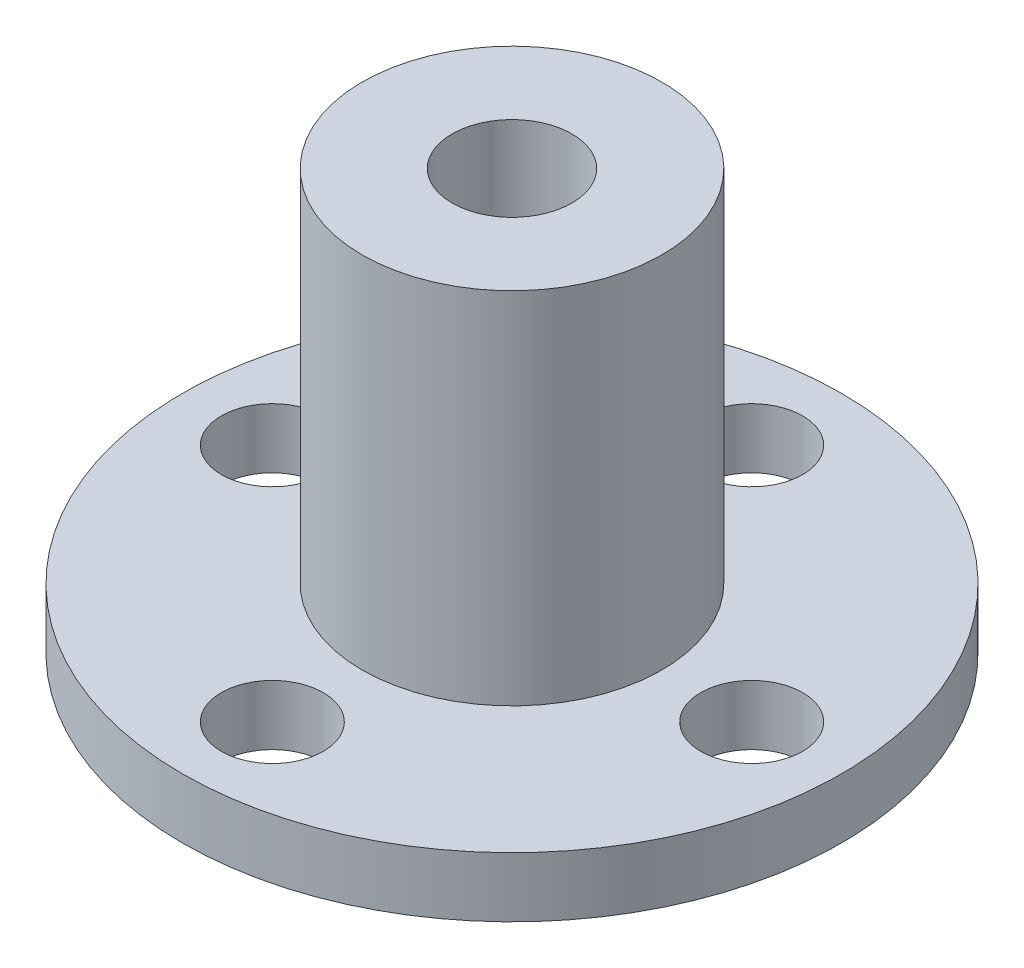
ISO-10303-21;
HEADER;
FILE_DESCRIPTION(('STEP AP214'),'2;1');
FILE_NAME('part.step','',(''),(''),'','','');
FILE_SCHEMA(('AUTOMOTIVE_DESIGN { 1 0 10303 214 1 1 1 1 }'));
ENDSEC;
DATA;
#1=APPLICATION_CONTEXT('core data for automotive mechanical design processes');
#2=APPLICATION_PROTOCOL_DEFINITION('international standard','automotive_design',2000,#1);
#3=PRODUCT_CONTEXT('',#1,'mechanical');
#4=PRODUCT('Part','Part','',(#3));
#5=PRODUCT_RELATED_PRODUCT_CATEGORY('part','',(#4));
#6=PRODUCT_DEFINITION_FORMATION('','',#4);
#7=PRODUCT_DEFINITION_CONTEXT('part definition',#1,'design');
#8=PRODUCT_DEFINITION('design','',#6,#7);
#9=PRODUCT_DEFINITION_SHAPE('','',#8);
#10=(LENGTH_UNIT() NAMED_UNIT(*) SI_UNIT(.MILLI.,.METRE.));
#11=(NAMED_UNIT(*) PLANE_ANGLE_UNIT() SI_UNIT($,.RADIAN.));
#12=(NAMED_UNIT(*) SI_UNIT($,.STERADIAN.) SOLID_ANGLE_UNIT());
#13=UNCERTAINTY_MEASURE_WITH_UNIT(LENGTH_MEASURE(1.E-05),#10,'distance_accuracy_value','');
#14=(GEOMETRIC_REPRESENTATION_CONTEXT(3) GLOBAL_UNCERTAINTY_ASSIGNED_CONTEXT((#13)) GLOBAL_UNIT_ASSIGNED_CONTEXT((#10,
#11,#12)) REPRESENTATION_CONTEXT('',''));
#15=CARTESIAN_POINT('',(0.,0.,0.));
#16=DIRECTION('',(0.,0.,1.));
#17=DIRECTION('',(1.,0.,0.));
#18=AXIS2_PLACEMENT_3D('',#15,#16,#17);
#19=CARTESIAN_POINT('',(0.,2.,0.));
#20=DIRECTION('',(0.,-1.,0.));
#21=DIRECTION('',(0.,0.,-1.));
#22=AXIS2_PLACEMENT_3D('',#19,#20,#21);
#23=CYLINDRICAL_SURFACE('',#22,11.);
#24=CARTESIAN_POINT('',(0.,2.,0.));
#25=DIRECTION('',(0.,1.,0.));
#26=DIRECTION('',(0.,0.,1.));
#27=AXIS2_PLACEMENT_3D('',#24,#25,#26);
#28=CIRCLE('',#27,11.);
#29=CARTESIAN_POINT('',(0.,2.,11.));
#30=VERTEX_POINT('',#29);
#31=EDGE_CURVE('E54',#30,#30,#28,.T.);
#32=ORIENTED_EDGE('',*,*,#31,.F.);
#33=EDGE_LOOP('',(#32));
#34=FACE_BOUND('',#33,.T.);
#35=CARTESIAN_POINT('',(0.,0.,0.));
#36=DIRECTION('',(0.,1.,0.));
#37=DIRECTION('',(0.,0.,1.));
#38=AXIS2_PLACEMENT_3D('',#35,#36,#37);
#39=CIRCLE('',#38,11.);
#40=CARTESIAN_POINT('',(0.,0.,11.));
#41=VERTEX_POINT('',#40);
#42=EDGE_CURVE('E50',#41,#41,#39,.T.);
#43=ORIENTED_EDGE('',*,*,#42,.T.);
#44=EDGE_LOOP('',(#43));
#45=FACE_BOUND('',#44,.T.);
#46=ADVANCED_FACE('F47',(#34,#45),#23,.T.);
#47=CARTESIAN_POINT('',(0.,2.,0.));
#48=DIRECTION('',(0.,1.,0.));
#49=DIRECTION('',(0.,0.,1.));
#50=AXIS2_PLACEMENT_3D('',#47,#48,#49);
#51=PLANE('',#50);
#52=CARTESIAN_POINT('',(0.,2.,-8.));
#53=DIRECTION('',(0.,1.,0.));
#54=DIRECTION('',(0.,0.,1.));
#55=AXIS2_PLACEMENT_3D('',#52,#53,#54);
#56=CIRCLE('',#55,1.7);
#57=CARTESIAN_POINT('',(0.,2.,-6.3));
#58=VERTEX_POINT('',#57);
#59=EDGE_CURVE('E88',#58,#58,#56,.T.);
#60=ORIENTED_EDGE('',*,*,#59,.F.);
#61=EDGE_LOOP('',(#60));
#62=FACE_BOUND('',#61,.T.);
#63=CARTESIAN_POINT('',(8.,2.,0.));
#64=DIRECTION('',(0.,1.,0.));
#65=DIRECTION('',(0.,0.,1.));
#66=AXIS2_PLACEMENT_3D('',#63,#64,#65);
#67=CIRCLE('',#66,1.7);
#68=CARTESIAN_POINT('',(8.,2.,1.69999999999999));
#69=VERTEX_POINT('',#68);
#70=EDGE_CURVE('E85',#69,#69,#67,.T.);
#71=ORIENTED_EDGE('',*,*,#70,.F.);
#72=EDGE_LOOP('',(#71));
#73=FACE_BOUND('',#72,.T.);
#74=CARTESIAN_POINT('',(0.,2.,8.));
#75=DIRECTION('',(0.,1.,0.));
#76=DIRECTION('',(0.,0.,1.));
#77=AXIS2_PLACEMENT_3D('',#74,#75,#76);
#78=CIRCLE('',#77,1.7);
#79=CARTESIAN_POINT('',(0.,2.,9.7));
#80=VERTEX_POINT('',#79);
#81=EDGE_CURVE('E79',#80,#80,#78,.T.);
#82=ORIENTED_EDGE('',*,*,#81,.F.);
#83=EDGE_LOOP('',(#82));
#84=FACE_BOUND('',#83,.T.);
#85=CARTESIAN_POINT('',(-8.,2.,0.));
#86=DIRECTION('',(0.,1.,0.));
#87=DIRECTION('',(0.,0.,1.));
#88=AXIS2_PLACEMENT_3D('',#85,#86,#87);
#89=CIRCLE('',#88,1.7);
#90=CARTESIAN_POINT('',(-8.,2.,1.7));
#91=VERTEX_POINT('',#90);
#92=EDGE_CURVE('E73',#91,#91,#89,.T.);
#93=ORIENTED_EDGE('',*,*,#92,.F.);
#94=EDGE_LOOP('',(#93));
#95=FACE_BOUND('',#94,.T.);
#96=CARTESIAN_POINT('',(0.,2.,0.));
#97=DIRECTION('',(0.,1.,0.));
#98=DIRECTION('',(0.,0.,1.));
#99=AXIS2_PLACEMENT_3D('',#96,#97,#98);
#100=CIRCLE('',#99,5.);
#101=CARTESIAN_POINT('',(0.,2.,5.));
#102=VERTEX_POINT('',#101);
#103=EDGE_CURVE('E10',#102,#102,#100,.T.);
#104=ORIENTED_EDGE('',*,*,#103,.F.);
#105=EDGE_LOOP('',(#104));
#106=FACE_BOUND('',#105,.T.);
#107=ORIENTED_EDGE('',*,*,#31,.T.);
#108=EDGE_LOOP('',(#107));
#109=FACE_BOUND('',#108,.T.);
#110=ADVANCED_FACE('F104',(#62,#73,#84,#95,#106,#109),#51,.T.);
#111=CARTESIAN_POINT('',(0.,0.,0.));
#112=DIRECTION('',(0.,1.,0.));
#113=DIRECTION('',(0.,0.,1.));
#114=AXIS2_PLACEMENT_3D('',#111,#112,#113);
#115=PLANE('',#114);
#116=CARTESIAN_POINT('',(0.,0.,-8.));
#117=DIRECTION('',(0.,1.,0.));
#118=DIRECTION('',(0.,0.,1.));
#119=AXIS2_PLACEMENT_3D('',#116,#117,#118);
#120=CIRCLE('',#119,1.7);
#121=CARTESIAN_POINT('',(0.,0.,-6.3));
#122=VERTEX_POINT('',#121);
#123=EDGE_CURVE('E67',#122,#122,#120,.T.);
#124=ORIENTED_EDGE('',*,*,#123,.T.);
#125=EDGE_LOOP('',(#124));
#126=FACE_BOUND('',#125,.T.);
#127=CARTESIAN_POINT('',(8.,0.,0.));
#128=DIRECTION('',(0.,1.,0.));
#129=DIRECTION('',(0.,0.,1.));
#130=AXIS2_PLACEMENT_3D('',#127,#128,#129);
#131=CIRCLE('',#130,1.7);
#132=CARTESIAN_POINT('',(8.,0.,1.69999999999999));
#133=VERTEX_POINT('',#132);
#134=EDGE_CURVE('E82',#133,#133,#131,.T.);
#135=ORIENTED_EDGE('',*,*,#134,.T.);
#136=EDGE_LOOP('',(#135));
#137=FACE_BOUND('',#136,.T.);
#138=CARTESIAN_POINT('',(0.,0.,8.));
#139=DIRECTION('',(0.,1.,0.));
#140=DIRECTION('',(0.,0.,1.));
#141=AXIS2_PLACEMENT_3D('',#138,#139,#140);
#142=CIRCLE('',#141,1.7);
#143=CARTESIAN_POINT('',(0.,0.,9.7));
#144=VERTEX_POINT('',#143);
#145=EDGE_CURVE('E76',#144,#144,#142,.T.);
#146=ORIENTED_EDGE('',*,*,#145,.T.);
#147=EDGE_LOOP('',(#146));
#148=FACE_BOUND('',#147,.T.);
#149=CARTESIAN_POINT('',(-8.,0.,0.));
#150=DIRECTION('',(0.,1.,0.));
#151=DIRECTION('',(0.,0.,1.));
#152=AXIS2_PLACEMENT_3D('',#149,#150,#151);
#153=CIRCLE('',#152,1.7);
#154=CARTESIAN_POINT('',(-8.,0.,1.7));
#155=VERTEX_POINT('',#154);
#156=EDGE_CURVE('E70',#155,#155,#153,.T.);
#157=ORIENTED_EDGE('',*,*,#156,.T.);
#158=EDGE_LOOP('',(#157));
#159=FACE_BOUND('',#158,.T.);
#160=CARTESIAN_POINT('',(0.,0.,0.));
#161=DIRECTION('',(0.,1.,0.));
#162=DIRECTION('',(0.,0.,1.));
#163=AXIS2_PLACEMENT_3D('',#160,#161,#162);
#164=CIRCLE('',#163,2.);
#165=CARTESIAN_POINT('',(0.,0.,2.));
#166=VERTEX_POINT('',#165);
#167=EDGE_CURVE('E63',#166,#166,#164,.T.);
#168=ORIENTED_EDGE('',*,*,#167,.T.);
#169=EDGE_LOOP('',(#168));
#170=FACE_BOUND('',#169,.T.);
#171=ORIENTED_EDGE('',*,*,#42,.F.);
#172=EDGE_LOOP('',(#171));
#173=FACE_BOUND('',#172,.T.);
#174=ADVANCED_FACE('F94',(#126,#137,#148,#159,#170,#173),#115,.F.);
#175=CARTESIAN_POINT('',(0.,14.,0.));
#176=DIRECTION('',(0.,-1.,0.));
#177=DIRECTION('',(0.,0.,-1.));
#178=AXIS2_PLACEMENT_3D('',#175,#176,#177);
#179=CYLINDRICAL_SURFACE('',#178,5.);
#180=CARTESIAN_POINT('',(0.,14.,0.));
#181=DIRECTION('',(0.,1.,0.));
#182=DIRECTION('',(0.,0.,1.));
#183=AXIS2_PLACEMENT_3D('',#180,#181,#182);
#184=CIRCLE('',#183,5.);
#185=CARTESIAN_POINT('',(0.,14.,5.));
#186=VERTEX_POINT('',#185);
#187=EDGE_CURVE('E60',#186,#186,#184,.T.);
#188=ORIENTED_EDGE('',*,*,#187,.F.);
#189=EDGE_LOOP('',(#188));
#190=FACE_BOUND('',#189,.T.);
#191=ORIENTED_EDGE('',*,*,#103,.T.);
#192=EDGE_LOOP('',(#191));
#193=FACE_BOUND('',#192,.T.);
#194=ADVANCED_FACE('F123',(#190,#193),#179,.T.);
#195=CARTESIAN_POINT('',(0.,14.,0.));
#196=DIRECTION('',(0.,1.,0.));
#197=DIRECTION('',(0.,0.,1.));
#198=AXIS2_PLACEMENT_3D('',#195,#196,#197);
#199=PLANE('',#198);
#200=CARTESIAN_POINT('',(0.,14.,0.));
#201=DIRECTION('',(0.,1.,0.));
#202=DIRECTION('',(0.,0.,1.));
#203=AXIS2_PLACEMENT_3D('',#200,#201,#202);
#204=CIRCLE('',#203,2.);
#205=CARTESIAN_POINT('',(0.,14.,2.));
#206=VERTEX_POINT('',#205);
#207=EDGE_CURVE('E64',#206,#206,#204,.T.);
#208=ORIENTED_EDGE('',*,*,#207,.F.);
#209=EDGE_LOOP('',(#208));
#210=FACE_BOUND('',#209,.T.);
#211=ORIENTED_EDGE('',*,*,#187,.T.);
#212=EDGE_LOOP('',(#211));
#213=FACE_BOUND('',#212,.T.);
#214=ADVANCED_FACE('F128',(#210,#213),#199,.T.);
#215=CARTESIAN_POINT('',(0.,0.,0.));
#216=DIRECTION('',(0.,1.,0.));
#217=DIRECTION('',(0.,0.,1.));
#218=AXIS2_PLACEMENT_3D('',#215,#216,#217);
#219=CYLINDRICAL_SURFACE('',#218,2.);
#220=ORIENTED_EDGE('',*,*,#167,.F.);
#221=EDGE_LOOP('',(#220));
#222=FACE_BOUND('',#221,.T.);
#223=ORIENTED_EDGE('',*,*,#207,.T.);
#224=EDGE_LOOP('',(#223));
#225=FACE_BOUND('',#224,.T.);
#226=ADVANCED_FACE('F134',(#222,#225),#219,.F.);
#227=CARTESIAN_POINT('',(-8.,0.,0.));
#228=DIRECTION('',(0.,1.,0.));
#229=DIRECTION('',(0.,0.,1.));
#230=AXIS2_PLACEMENT_3D('',#227,#228,#229);
#231=CYLINDRICAL_SURFACE('',#230,1.7);
#232=ORIENTED_EDGE('',*,*,#156,.F.);
#233=EDGE_LOOP('',(#232));
#234=FACE_BOUND('',#233,.T.);
#235=ORIENTED_EDGE('',*,*,#92,.T.);
#236=EDGE_LOOP('',(#235));
#237=FACE_BOUND('',#236,.T.);
#238=ADVANCED_FACE('F138',(#234,#237),#231,.F.);
#239=CARTESIAN_POINT('',(0.,0.,8.));
#240=DIRECTION('',(0.,1.,0.));
#241=DIRECTION('',(0.,0.,1.));
#242=AXIS2_PLACEMENT_3D('',#239,#240,#241);
#243=CYLINDRICAL_SURFACE('',#242,1.7);
#244=ORIENTED_EDGE('',*,*,#145,.F.);
#245=EDGE_LOOP('',(#244));
#246=FACE_BOUND('',#245,.T.);
#247=ORIENTED_EDGE('',*,*,#81,.T.);
#248=EDGE_LOOP('',(#247));
#249=FACE_BOUND('',#248,.T.);
#250=ADVANCED_FACE('F141',(#246,#249),#243,.F.);
#251=CARTESIAN_POINT('',(8.,0.,0.));
#252=DIRECTION('',(0.,1.,0.));
#253=DIRECTION('',(0.,0.,1.));
#254=AXIS2_PLACEMENT_3D('',#251,#252,#253);
#255=CYLINDRICAL_SURFACE('',#254,1.7);
#256=ORIENTED_EDGE('',*,*,#134,.F.);
#257=EDGE_LOOP('',(#256));
#258=FACE_BOUND('',#257,.T.);
#259=ORIENTED_EDGE('',*,*,#70,.T.);
#260=EDGE_LOOP('',(#259));
#261=FACE_BOUND('',#260,.T.);
#262=ADVANCED_FACE('F100',(#258,#261),#255,.F.);
#263=CARTESIAN_POINT('',(0.,0.,-8.));
#264=DIRECTION('',(0.,1.,0.));
#265=DIRECTION('',(0.,0.,1.));
#266=AXIS2_PLACEMENT_3D('',#263,#264,#265);
#267=CYLINDRICAL_SURFACE('',#266,1.7);
#268=ORIENTED_EDGE('',*,*,#123,.F.);
#269=EDGE_LOOP('',(#268));
#270=FACE_BOUND('',#269,.T.);
#271=ORIENTED_EDGE('',*,*,#59,.T.);
#272=EDGE_LOOP('',(#271));
#273=FACE_BOUND('',#272,.T.);
#274=ADVANCED_FACE('F97',(#270,#273),#267,.F.);
#275=CLOSED_SHELL('',(#46,#110,#174,#194,#214,#226,#238,#250,#262,#274));
#276=MANIFOLD_SOLID_BREP('B2',#275);
#277=ADVANCED_BREP_SHAPE_REPRESENTATION('',(#18,#276),#14);
#278=SHAPE_DEFINITION_REPRESENTATION(#9,#277);
ENDSEC;
END-ISO-10303-21;
